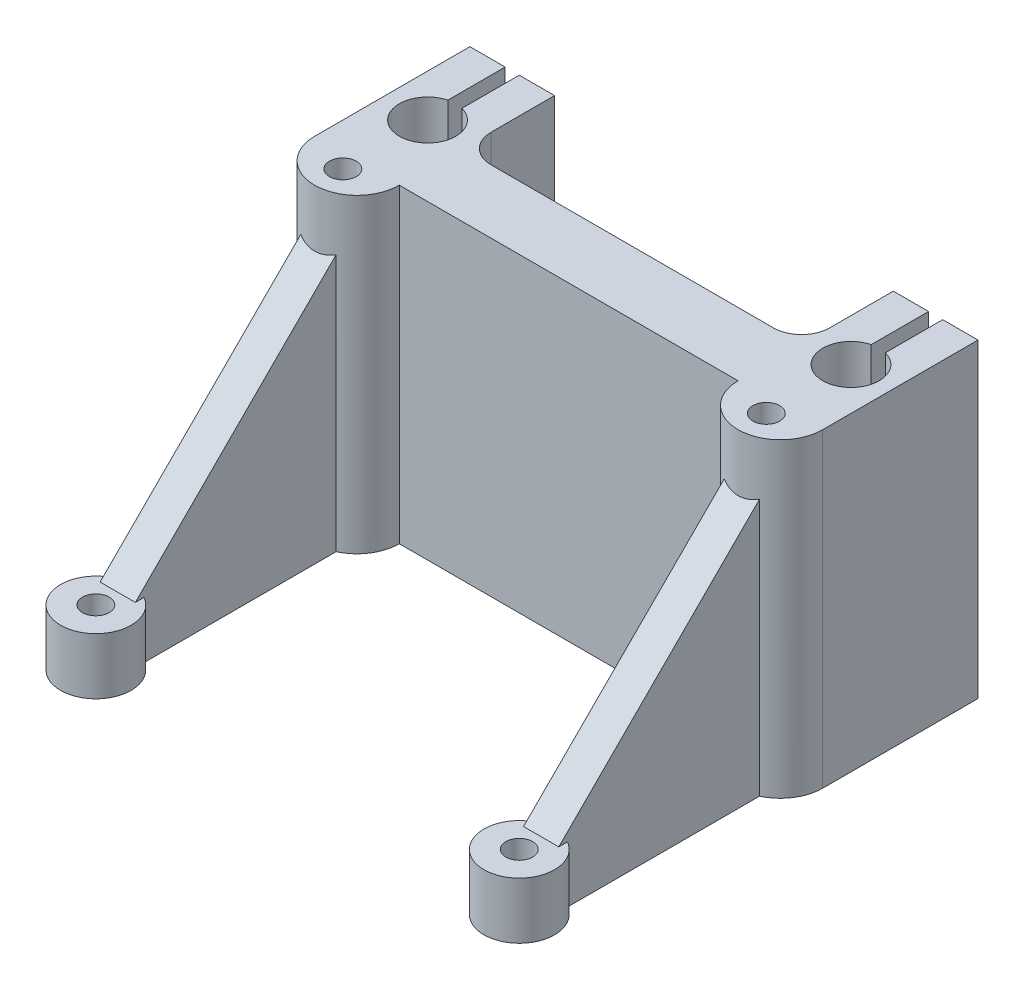
ISO-10303-21;
HEADER;
FILE_DESCRIPTION(('STEP AP214'),'2;1');
FILE_NAME('part.step','',(''),(''),'','','');
FILE_SCHEMA(('AUTOMOTIVE_DESIGN { 1 0 10303 214 1 1 1 1 }'));
ENDSEC;
DATA;
#1=APPLICATION_CONTEXT('core data for automotive mechanical design processes');
#2=APPLICATION_PROTOCOL_DEFINITION('international standard','automotive_design',2000,#1);
#3=PRODUCT_CONTEXT('',#1,'mechanical');
#4=PRODUCT('Part','Part','',(#3));
#5=PRODUCT_RELATED_PRODUCT_CATEGORY('part','',(#4));
#6=PRODUCT_DEFINITION_FORMATION('','',#4);
#7=PRODUCT_DEFINITION_CONTEXT('part definition',#1,'design');
#8=PRODUCT_DEFINITION('design','',#6,#7);
#9=PRODUCT_DEFINITION_SHAPE('','',#8);
#10=(LENGTH_UNIT() NAMED_UNIT(*) SI_UNIT(.MILLI.,.METRE.));
#11=(NAMED_UNIT(*) PLANE_ANGLE_UNIT() SI_UNIT($,.RADIAN.));
#12=(NAMED_UNIT(*) SI_UNIT($,.STERADIAN.) SOLID_ANGLE_UNIT());
#13=UNCERTAINTY_MEASURE_WITH_UNIT(LENGTH_MEASURE(1.E-05),#10,'distance_accuracy_value','');
#14=(GEOMETRIC_REPRESENTATION_CONTEXT(3) GLOBAL_UNCERTAINTY_ASSIGNED_CONTEXT((#13)) GLOBAL_UNIT_ASSIGNED_CONTEXT((#10,
#11,#12)) REPRESENTATION_CONTEXT('',''));
#15=CARTESIAN_POINT('',(0.,0.,0.));
#16=DIRECTION('',(0.,0.,1.));
#17=DIRECTION('',(1.,0.,0.));
#18=AXIS2_PLACEMENT_3D('',#15,#16,#17);
#19=CARTESIAN_POINT('',(30.,8.,47.));
#20=DIRECTION('',(0.,-1.,0.));
#21=DIRECTION('',(0.,0.,-1.));
#22=AXIS2_PLACEMENT_3D('',#19,#20,#21);
#23=CYLINDRICAL_SURFACE('',#22,5.);
#24=CARTESIAN_POINT('',(30.,8.,47.));
#25=DIRECTION('',(0.,1.,0.));
#26=DIRECTION('',(0.,0.,-1.));
#27=AXIS2_PLACEMENT_3D('',#24,#25,#26);
#28=CIRCLE('',#27,5.);
#29=CARTESIAN_POINT('',(30.,8.,42.));
#30=VERTEX_POINT('',#29);
#31=EDGE_CURVE('E11',#30,#30,#28,.T.);
#32=ORIENTED_EDGE('',*,*,#31,.F.);
#33=EDGE_LOOP('',(#32));
#34=FACE_BOUND('',#33,.T.);
#35=CARTESIAN_POINT('',(30.,0.,47.));
#36=DIRECTION('',(0.,1.,0.));
#37=DIRECTION('',(0.,0.,-1.));
#38=AXIS2_PLACEMENT_3D('',#35,#36,#37);
#39=CIRCLE('',#38,5.);
#40=CARTESIAN_POINT('',(30.,0.,42.));
#41=VERTEX_POINT('',#40);
#42=EDGE_CURVE('E43',#41,#41,#39,.T.);
#43=ORIENTED_EDGE('',*,*,#42,.T.);
#44=EDGE_LOOP('',(#43));
#45=FACE_BOUND('',#44,.T.);
#46=ADVANCED_FACE('F40',(#34,#45),#23,.T.);
#47=CARTESIAN_POINT('',(30.,8.,47.));
#48=DIRECTION('',(0.,-1.,0.));
#49=DIRECTION('',(0.,0.,-1.));
#50=AXIS2_PLACEMENT_3D('',#47,#48,#49);
#51=PLANE('',#50);
#52=CARTESIAN_POINT('',(30.0000000000003,8.,46.9999999999998));
#53=DIRECTION('',(0.,1.,0.));
#54=DIRECTION('',(0.,0.,-1.));
#55=AXIS2_PLACEMENT_3D('',#52,#53,#54);
#56=CIRCLE('',#55,1.9);
#57=CARTESIAN_POINT('',(30.0000000000003,8.,45.0999999999998));
#58=VERTEX_POINT('',#57);
#59=EDGE_CURVE('E52',#58,#58,#56,.T.);
#60=ORIENTED_EDGE('',*,*,#59,.F.);
#61=EDGE_LOOP('',(#60));
#62=FACE_BOUND('',#61,.T.);
#63=ORIENTED_EDGE('',*,*,#31,.T.);
#64=EDGE_LOOP('',(#63));
#65=FACE_BOUND('',#64,.T.);
#66=ADVANCED_FACE('F67',(#62,#65),#51,.F.);
#67=CARTESIAN_POINT('',(30.,0.,47.));
#68=DIRECTION('',(0.,-1.,0.));
#69=DIRECTION('',(0.,0.,-1.));
#70=AXIS2_PLACEMENT_3D('',#67,#68,#69);
#71=PLANE('',#70);
#72=CARTESIAN_POINT('',(30.0000000000003,0.,46.9999999999998));
#73=DIRECTION('',(0.,1.,0.));
#74=DIRECTION('',(0.,0.,-1.));
#75=AXIS2_PLACEMENT_3D('',#72,#73,#74);
#76=CIRCLE('',#75,1.9);
#77=CARTESIAN_POINT('',(30.0000000000003,0.,45.0999999999998));
#78=VERTEX_POINT('',#77);
#79=EDGE_CURVE('E50',#78,#78,#76,.T.);
#80=ORIENTED_EDGE('',*,*,#79,.T.);
#81=EDGE_LOOP('',(#80));
#82=FACE_BOUND('',#81,.T.);
#83=ORIENTED_EDGE('',*,*,#42,.F.);
#84=EDGE_LOOP('',(#83));
#85=FACE_BOUND('',#84,.T.);
#86=ADVANCED_FACE('F58',(#82,#85),#71,.T.);
#87=CARTESIAN_POINT('',(30.0000000000003,0.,46.9999999999998));
#88=DIRECTION('',(0.,1.,0.));
#89=DIRECTION('',(0.,0.,1.));
#90=AXIS2_PLACEMENT_3D('',#87,#88,#89);
#91=CYLINDRICAL_SURFACE('',#90,1.9);
#92=ORIENTED_EDGE('',*,*,#79,.F.);
#93=EDGE_LOOP('',(#92));
#94=FACE_BOUND('',#93,.T.);
#95=ORIENTED_EDGE('',*,*,#59,.T.);
#96=EDGE_LOOP('',(#95));
#97=FACE_BOUND('',#96,.T.);
#98=ADVANCED_FACE('F61',(#94,#97),#91,.F.);
#99=CLOSED_SHELL('',(#46,#66,#86,#98));
#100=MANIFOLD_SOLID_BREP('B2',#99);
#101=CARTESIAN_POINT('',(-30.,8.,47.));
#102=DIRECTION('',(0.,-1.,0.));
#103=DIRECTION('',(0.,0.,-1.));
#104=AXIS2_PLACEMENT_3D('',#101,#102,#103);
#105=CYLINDRICAL_SURFACE('',#104,5.);
#106=CARTESIAN_POINT('',(-30.,8.,47.));
#107=DIRECTION('',(0.,1.,0.));
#108=DIRECTION('',(0.,0.,1.));
#109=AXIS2_PLACEMENT_3D('',#106,#107,#108);
#110=CIRCLE('',#109,5.);
#111=CARTESIAN_POINT('',(-30.,8.,52.));
#112=VERTEX_POINT('',#111);
#113=EDGE_CURVE('E39',#112,#112,#110,.T.);
#114=ORIENTED_EDGE('',*,*,#113,.F.);
#115=EDGE_LOOP('',(#114));
#116=FACE_BOUND('',#115,.T.);
#117=CARTESIAN_POINT('',(-30.,0.,47.));
#118=DIRECTION('',(0.,1.,0.));
#119=DIRECTION('',(0.,0.,1.));
#120=AXIS2_PLACEMENT_3D('',#117,#118,#119);
#121=CIRCLE('',#120,5.);
#122=CARTESIAN_POINT('',(-30.,0.,52.));
#123=VERTEX_POINT('',#122);
#124=EDGE_CURVE('E114',#123,#123,#121,.T.);
#125=ORIENTED_EDGE('',*,*,#124,.T.);
#126=EDGE_LOOP('',(#125));
#127=FACE_BOUND('',#126,.T.);
#128=ADVANCED_FACE('F111',(#116,#127),#105,.T.);
#129=CARTESIAN_POINT('',(-30.,8.,47.));
#130=DIRECTION('',(0.,1.,0.));
#131=DIRECTION('',(0.,0.,1.));
#132=AXIS2_PLACEMENT_3D('',#129,#130,#131);
#133=PLANE('',#132);
#134=CARTESIAN_POINT('',(-30.,8.,47.));
#135=DIRECTION('',(0.,1.,0.));
#136=DIRECTION('',(0.,0.,1.));
#137=AXIS2_PLACEMENT_3D('',#134,#135,#136);
#138=CIRCLE('',#137,1.9);
#139=CARTESIAN_POINT('',(-30.,8.,48.9));
#140=VERTEX_POINT('',#139);
#141=EDGE_CURVE('E123',#140,#140,#138,.T.);
#142=ORIENTED_EDGE('',*,*,#141,.F.);
#143=EDGE_LOOP('',(#142));
#144=FACE_BOUND('',#143,.T.);
#145=ORIENTED_EDGE('',*,*,#113,.T.);
#146=EDGE_LOOP('',(#145));
#147=FACE_BOUND('',#146,.T.);
#148=ADVANCED_FACE('F138',(#144,#147),#133,.T.);
#149=CARTESIAN_POINT('',(-30.,0.,47.));
#150=DIRECTION('',(0.,1.,0.));
#151=DIRECTION('',(0.,0.,1.));
#152=AXIS2_PLACEMENT_3D('',#149,#150,#151);
#153=PLANE('',#152);
#154=CARTESIAN_POINT('',(-30.,0.,47.));
#155=DIRECTION('',(0.,1.,0.));
#156=DIRECTION('',(0.,0.,1.));
#157=AXIS2_PLACEMENT_3D('',#154,#155,#156);
#158=CIRCLE('',#157,1.9);
#159=CARTESIAN_POINT('',(-30.,0.,48.9));
#160=VERTEX_POINT('',#159);
#161=EDGE_CURVE('E121',#160,#160,#158,.T.);
#162=ORIENTED_EDGE('',*,*,#161,.T.);
#163=EDGE_LOOP('',(#162));
#164=FACE_BOUND('',#163,.T.);
#165=ORIENTED_EDGE('',*,*,#124,.F.);
#166=EDGE_LOOP('',(#165));
#167=FACE_BOUND('',#166,.T.);
#168=ADVANCED_FACE('F129',(#164,#167),#153,.F.);
#169=CARTESIAN_POINT('',(-30.,0.,47.));
#170=DIRECTION('',(0.,1.,0.));
#171=DIRECTION('',(0.,0.,1.));
#172=AXIS2_PLACEMENT_3D('',#169,#170,#171);
#173=CYLINDRICAL_SURFACE('',#172,1.9);
#174=ORIENTED_EDGE('',*,*,#161,.F.);
#175=EDGE_LOOP('',(#174));
#176=FACE_BOUND('',#175,.T.);
#177=ORIENTED_EDGE('',*,*,#141,.T.);
#178=EDGE_LOOP('',(#177));
#179=FACE_BOUND('',#178,.T.);
#180=ADVANCED_FACE('F132',(#176,#179),#173,.F.);
#181=CLOSED_SHELL('',(#128,#148,#168,#180));
#182=MANIFOLD_SOLID_BREP('B6',#181);
#183=CARTESIAN_POINT('',(30.,44.,10.));
#184=DIRECTION('',(0.,-1.,0.));
#185=DIRECTION('',(0.,0.,-1.));
#186=AXIS2_PLACEMENT_3D('',#183,#184,#185);
#187=CYLINDRICAL_SURFACE('',#186,5.99999999999999);
#188=DIRECTION('',(0.,-1.,0.));
#189=VECTOR('',#188,1.);
#190=CARTESIAN_POINT('',(32.5,44.,15.4543560573179));
#191=LINE('',#190,#189);
#192=CARTESIAN_POINT('',(32.5,0.,15.4543560573179));
#193=VERTEX_POINT('',#192);
#194=CARTESIAN_POINT('',(32.5,36.4456439426818,15.4543560573179));
#195=VERTEX_POINT('',#194);
#196=EDGE_CURVE('E109',#193,#195,#191,.F.);
#197=ORIENTED_EDGE('',*,*,#196,.F.);
#198=CARTESIAN_POINT('',(30.,0.,10.));
#199=DIRECTION('',(0.,1.,0.));
#200=DIRECTION('',(0.,0.,1.));
#201=AXIS2_PLACEMENT_3D('',#198,#199,#200);
#202=CIRCLE('',#201,5.99999999999999);
#203=CARTESIAN_POINT('',(36.,0.,10.));
#204=VERTEX_POINT('',#203);
#205=EDGE_CURVE('E366',#193,#204,#202,.T.);
#206=ORIENTED_EDGE('',*,*,#205,.T.);
#207=DIRECTION('',(0.,-1.,0.));
#208=VECTOR('',#207,1.);
#209=CARTESIAN_POINT('',(36.,44.,10.));
#210=LINE('',#209,#208);
#211=CARTESIAN_POINT('',(36.,44.,10.));
#212=VERTEX_POINT('',#211);
#213=EDGE_CURVE('E511',#212,#204,#210,.T.);
#214=ORIENTED_EDGE('',*,*,#213,.F.);
#215=CARTESIAN_POINT('',(30.,44.,10.));
#216=DIRECTION('',(0.,1.,0.));
#217=DIRECTION('',(0.,0.,1.));
#218=AXIS2_PLACEMENT_3D('',#215,#216,#217);
#219=CIRCLE('',#218,5.99999999999999);
#220=CARTESIAN_POINT('',(24.,44.,10.));
#221=VERTEX_POINT('',#220);
#222=EDGE_CURVE('E509',#221,#212,#219,.T.);
#223=ORIENTED_EDGE('',*,*,#222,.F.);
#224=DIRECTION('',(0.,-1.,0.));
#225=VECTOR('',#224,1.);
#226=CARTESIAN_POINT('',(24.,44.,10.));
#227=LINE('',#226,#225);
#228=CARTESIAN_POINT('',(24.,0.,10.));
#229=VERTEX_POINT('',#228);
#230=EDGE_CURVE('E532',#221,#229,#227,.T.);
#231=ORIENTED_EDGE('',*,*,#230,.T.);
#232=CARTESIAN_POINT('',(27.5,0.,15.4543560573179));
#233=VERTEX_POINT('',#232);
#234=EDGE_CURVE('E497',#229,#233,#202,.T.);
#235=ORIENTED_EDGE('',*,*,#234,.T.);
#236=DIRECTION('',(0.,-1.,0.));
#237=VECTOR('',#236,1.);
#238=CARTESIAN_POINT('',(27.5,44.,15.4543560573178));
#239=LINE('',#238,#237);
#240=CARTESIAN_POINT('',(27.5,36.4456439426818,15.4543560573178));
#241=VERTEX_POINT('',#240);
#242=EDGE_CURVE('E181',#233,#241,#239,.F.);
#243=ORIENTED_EDGE('',*,*,#242,.T.);
#244=CARTESIAN_POINT('',(30.,41.8999999999996,10.));
#245=DIRECTION('',(0.,0.707106781186552,0.707106781186543));
#246=DIRECTION('',(0.,-0.707106781186543,0.707106781186552));
#247=AXIS2_PLACEMENT_3D('',#244,#245,#246);
#248=ELLIPSE('',#247,8.48528137423851,5.99999999999999);
#249=EDGE_CURVE('E378',#241,#195,#248,.T.);
#250=ORIENTED_EDGE('',*,*,#249,.T.);
#251=EDGE_LOOP('',(#197,#206,#214,#223,#231,#235,#243,#250));
#252=FACE_BOUND('',#251,.T.);
#253=ADVANCED_FACE('F173',(#252),#187,.T.);
#254=CARTESIAN_POINT('',(-30.,44.,10.));
#255=DIRECTION('',(0.,-1.,0.));
#256=DIRECTION('',(0.,0.,-1.));
#257=AXIS2_PLACEMENT_3D('',#254,#255,#256);
#258=CYLINDRICAL_SURFACE('',#257,6.);
#259=DIRECTION('',(0.,-1.,0.));
#260=VECTOR('',#259,1.);
#261=CARTESIAN_POINT('',(-32.5,44.,15.4543560573179));
#262=LINE('',#261,#260);
#263=CARTESIAN_POINT('',(-32.5,36.4456439426818,15.4543560573179));
#264=VERTEX_POINT('',#263);
#265=CARTESIAN_POINT('',(-32.5,0.,15.4543560573179));
#266=VERTEX_POINT('',#265);
#267=EDGE_CURVE('E579',#264,#266,#262,.T.);
#268=ORIENTED_EDGE('',*,*,#267,.F.);
#269=CARTESIAN_POINT('',(-30.,41.8999999999996,10.));
#270=DIRECTION('',(0.,-0.707106781186552,-0.707106781186543));
#271=DIRECTION('',(0.,-0.707106781186543,0.707106781186552));
#272=AXIS2_PLACEMENT_3D('',#269,#270,#271);
#273=ELLIPSE('',#272,8.48528137423852,6.);
#274=CARTESIAN_POINT('',(-27.5,36.4456439426818,15.4543560573179));
#275=VERTEX_POINT('',#274);
#276=EDGE_CURVE('E414',#275,#264,#273,.T.);
#277=ORIENTED_EDGE('',*,*,#276,.F.);
#278=DIRECTION('',(0.,-1.,0.));
#279=VECTOR('',#278,1.);
#280=CARTESIAN_POINT('',(-27.5,44.,15.4543560573179));
#281=LINE('',#280,#279);
#282=CARTESIAN_POINT('',(-27.5,0.,15.4543560573179));
#283=VERTEX_POINT('',#282);
#284=EDGE_CURVE('E577',#275,#283,#281,.T.);
#285=ORIENTED_EDGE('',*,*,#284,.T.);
#286=CARTESIAN_POINT('',(-30.,0.,10.));
#287=DIRECTION('',(0.,1.,0.));
#288=DIRECTION('',(0.,0.,-1.));
#289=AXIS2_PLACEMENT_3D('',#286,#287,#288);
#290=CIRCLE('',#289,6.);
#291=CARTESIAN_POINT('',(-24.,0.,10.));
#292=VERTEX_POINT('',#291);
#293=EDGE_CURVE('E522',#283,#292,#290,.T.);
#294=ORIENTED_EDGE('',*,*,#293,.T.);
#295=DIRECTION('',(0.,-1.,0.));
#296=VECTOR('',#295,1.);
#297=CARTESIAN_POINT('',(-24.,44.,10.));
#298=LINE('',#297,#296);
#299=CARTESIAN_POINT('',(-24.,44.,10.));
#300=VERTEX_POINT('',#299);
#301=EDGE_CURVE('E535',#300,#292,#298,.T.);
#302=ORIENTED_EDGE('',*,*,#301,.F.);
#303=CARTESIAN_POINT('',(-30.,44.,10.));
#304=DIRECTION('',(0.,1.,0.));
#305=DIRECTION('',(0.,0.,-1.));
#306=AXIS2_PLACEMENT_3D('',#303,#304,#305);
#307=CIRCLE('',#306,6.);
#308=CARTESIAN_POINT('',(-36.,44.,10.));
#309=VERTEX_POINT('',#308);
#310=EDGE_CURVE('E505',#309,#300,#307,.T.);
#311=ORIENTED_EDGE('',*,*,#310,.F.);
#312=DIRECTION('',(0.,-1.,0.));
#313=VECTOR('',#312,1.);
#314=CARTESIAN_POINT('',(-36.,44.,10.));
#315=LINE('',#314,#313);
#316=CARTESIAN_POINT('',(-36.,0.,10.));
#317=VERTEX_POINT('',#316);
#318=EDGE_CURVE('E538',#309,#317,#315,.T.);
#319=ORIENTED_EDGE('',*,*,#318,.T.);
#320=EDGE_CURVE('E523',#317,#266,#290,.T.);
#321=ORIENTED_EDGE('',*,*,#320,.T.);
#322=EDGE_LOOP('',(#268,#277,#285,#294,#302,#311,#319,#321));
#323=FACE_BOUND('',#322,.T.);
#324=ADVANCED_FACE('F603',(#323),#258,.T.);
#325=CARTESIAN_POINT('',(-36.,44.,-12.));
#326=DIRECTION('',(0.,0.,1.));
#327=DIRECTION('',(1.,0.,0.));
#328=AXIS2_PLACEMENT_3D('',#325,#326,#327);
#329=PLANE('',#328);
#330=DIRECTION('',(-1.,0.,0.));
#331=VECTOR('',#330,1.);
#332=CARTESIAN_POINT('',(-36.,0.,-12.));
#333=LINE('',#332,#331);
#334=CARTESIAN_POINT('',(29.,0.,-12.));
#335=VERTEX_POINT('',#334);
#336=CARTESIAN_POINT('',(24.,0.,-12.));
#337=VERTEX_POINT('',#336);
#338=EDGE_CURVE('E519',#335,#337,#333,.T.);
#339=ORIENTED_EDGE('',*,*,#338,.T.);
#340=DIRECTION('',(0.,1.,0.));
#341=VECTOR('',#340,1.);
#342=CARTESIAN_POINT('',(24.,0.,-12.));
#343=LINE('',#342,#341);
#344=CARTESIAN_POINT('',(24.,44.,-12.));
#345=VERTEX_POINT('',#344);
#346=EDGE_CURVE('E426',#337,#345,#343,.T.);
#347=ORIENTED_EDGE('',*,*,#346,.T.);
#348=DIRECTION('',(-1.,0.,0.));
#349=VECTOR('',#348,1.);
#350=CARTESIAN_POINT('',(-36.,44.,-12.));
#351=LINE('',#350,#349);
#352=CARTESIAN_POINT('',(29.,44.,-12.));
#353=VERTEX_POINT('',#352);
#354=EDGE_CURVE('E502',#353,#345,#351,.T.);
#355=ORIENTED_EDGE('',*,*,#354,.F.);
#356=DIRECTION('',(0.,1.,0.));
#357=VECTOR('',#356,1.);
#358=CARTESIAN_POINT('',(29.,0.,-12.));
#359=LINE('',#358,#357);
#360=EDGE_CURVE('E448',#335,#353,#359,.T.);
#361=ORIENTED_EDGE('',*,*,#360,.F.);
#362=EDGE_LOOP('',(#339,#347,#355,#361));
#363=FACE_BOUND('',#362,.T.);
#364=ADVANCED_FACE('F628',(#363),#329,.F.);
#365=CARTESIAN_POINT('',(-30.,44.,10.));
#366=DIRECTION('',(0.,-1.,0.));
#367=DIRECTION('',(0.,0.,-1.));
#368=AXIS2_PLACEMENT_3D('',#365,#366,#367);
#369=PLANE('',#368);
#370=CARTESIAN_POINT('',(30.,44.,12.));
#371=DIRECTION('',(0.,-1.,0.));
#372=DIRECTION('',(0.,0.,1.));
#373=AXIS2_PLACEMENT_3D('',#370,#371,#372);
#374=CIRCLE('',#373,1.9);
#375=CARTESIAN_POINT('',(30.,44.,13.9));
#376=VERTEX_POINT('',#375);
#377=EDGE_CURVE('E450',#376,#376,#374,.T.);
#378=ORIENTED_EDGE('',*,*,#377,.T.);
#379=EDGE_LOOP('',(#378));
#380=FACE_BOUND('',#379,.T.);
#381=CARTESIAN_POINT('',(-30.,44.,12.));
#382=DIRECTION('',(0.,1.,0.));
#383=DIRECTION('',(0.,0.,1.));
#384=AXIS2_PLACEMENT_3D('',#381,#382,#383);
#385=CIRCLE('',#384,1.9);
#386=CARTESIAN_POINT('',(-30.,44.,13.9));
#387=VERTEX_POINT('',#386);
#388=EDGE_CURVE('E478',#387,#387,#385,.T.);
#389=ORIENTED_EDGE('',*,*,#388,.F.);
#390=EDGE_LOOP('',(#389));
#391=FACE_BOUND('',#390,.T.);
#392=ORIENTED_EDGE('',*,*,#354,.T.);
#393=DIRECTION('',(0.,0.,-1.));
#394=VECTOR('',#393,1.);
#395=CARTESIAN_POINT('',(24.,44.,1.));
#396=LINE('',#395,#394);
#397=CARTESIAN_POINT('',(24.,44.,-3.));
#398=VERTEX_POINT('',#397);
#399=EDGE_CURVE('E416',#398,#345,#396,.T.);
#400=ORIENTED_EDGE('',*,*,#399,.F.);
#401=CARTESIAN_POINT('',(20.,44.,-3.));
#402=DIRECTION('',(0.,-1.,0.));
#403=DIRECTION('',(0.,0.,-1.));
#404=AXIS2_PLACEMENT_3D('',#401,#402,#403);
#405=CIRCLE('',#404,4.);
#406=CARTESIAN_POINT('',(20.,44.,1.));
#407=VERTEX_POINT('',#406);
#408=EDGE_CURVE('E569',#398,#407,#405,.T.);
#409=ORIENTED_EDGE('',*,*,#408,.T.);
#410=DIRECTION('',(1.,0.,0.));
#411=VECTOR('',#410,1.);
#412=CARTESIAN_POINT('',(-24.,44.,1.));
#413=LINE('',#412,#411);
#414=CARTESIAN_POINT('',(-20.,44.,1.));
#415=VERTEX_POINT('',#414);
#416=EDGE_CURVE('E420',#415,#407,#413,.T.);
#417=ORIENTED_EDGE('',*,*,#416,.F.);
#418=CARTESIAN_POINT('',(-20.,44.,-3.));
#419=DIRECTION('',(0.,-1.,0.));
#420=DIRECTION('',(0.,0.,-1.));
#421=AXIS2_PLACEMENT_3D('',#418,#419,#420);
#422=CIRCLE('',#421,4.);
#423=CARTESIAN_POINT('',(-24.,44.,-3.));
#424=VERTEX_POINT('',#423);
#425=EDGE_CURVE('E573',#415,#424,#422,.T.);
#426=ORIENTED_EDGE('',*,*,#425,.T.);
#427=DIRECTION('',(0.,0.,1.));
#428=VECTOR('',#427,1.);
#429=CARTESIAN_POINT('',(-24.,44.,1.));
#430=LINE('',#429,#428);
#431=CARTESIAN_POINT('',(-24.,44.,-12.));
#432=VERTEX_POINT('',#431);
#433=EDGE_CURVE('E428',#432,#424,#430,.T.);
#434=ORIENTED_EDGE('',*,*,#433,.F.);
#435=CARTESIAN_POINT('',(-29.,44.,-12.));
#436=VERTEX_POINT('',#435);
#437=EDGE_CURVE('E503',#432,#436,#351,.T.);
#438=ORIENTED_EDGE('',*,*,#437,.T.);
#439=DIRECTION('',(0.,0.,-1.));
#440=VECTOR('',#439,1.);
#441=CARTESIAN_POINT('',(-29.,44.,-12.));
#442=LINE('',#441,#440);
#443=CARTESIAN_POINT('',(-29.,44.,-3.87298334620742));
#444=VERTEX_POINT('',#443);
#445=EDGE_CURVE('E462',#444,#436,#442,.T.);
#446=ORIENTED_EDGE('',*,*,#445,.F.);
#447=CARTESIAN_POINT('',(-30.,44.,0.));
#448=DIRECTION('',(0.,1.,0.));
#449=DIRECTION('',(0.,0.,1.));
#450=AXIS2_PLACEMENT_3D('',#447,#448,#449);
#451=CIRCLE('',#450,4.);
#452=CARTESIAN_POINT('',(-31.,44.,-3.87298334620741));
#453=VERTEX_POINT('',#452);
#454=EDGE_CURVE('E484',#453,#444,#451,.T.);
#455=ORIENTED_EDGE('',*,*,#454,.F.);
#456=DIRECTION('',(0.,0.,1.));
#457=VECTOR('',#456,1.);
#458=CARTESIAN_POINT('',(-31.,44.,-12.));
#459=LINE('',#458,#457);
#460=CARTESIAN_POINT('',(-31.,44.,-12.));
#461=VERTEX_POINT('',#460);
#462=EDGE_CURVE('E469',#461,#453,#459,.T.);
#463=ORIENTED_EDGE('',*,*,#462,.F.);
#464=CARTESIAN_POINT('',(-36.,44.,-12.));
#465=VERTEX_POINT('',#464);
#466=EDGE_CURVE('E496',#461,#465,#351,.T.);
#467=ORIENTED_EDGE('',*,*,#466,.T.);
#468=DIRECTION('',(0.,0.,1.));
#469=VECTOR('',#468,1.);
#470=CARTESIAN_POINT('',(-36.,44.,10.));
#471=LINE('',#470,#469);
#472=EDGE_CURVE('E501',#465,#309,#471,.T.);
#473=ORIENTED_EDGE('',*,*,#472,.T.);
#474=ORIENTED_EDGE('',*,*,#310,.T.);
#475=DIRECTION('',(1.,0.,0.));
#476=VECTOR('',#475,1.);
#477=CARTESIAN_POINT('',(-24.,44.,10.));
#478=LINE('',#477,#476);
#479=EDGE_CURVE('E507',#300,#221,#478,.T.);
#480=ORIENTED_EDGE('',*,*,#479,.T.);
#481=ORIENTED_EDGE('',*,*,#222,.T.);
#482=DIRECTION('',(0.,0.,-1.));
#483=VECTOR('',#482,1.);
#484=CARTESIAN_POINT('',(36.,44.,10.));
#485=LINE('',#484,#483);
#486=CARTESIAN_POINT('',(36.,44.,-12.));
#487=VERTEX_POINT('',#486);
#488=EDGE_CURVE('E493',#212,#487,#485,.T.);
#489=ORIENTED_EDGE('',*,*,#488,.T.);
#490=CARTESIAN_POINT('',(31.,44.,-12.));
#491=VERTEX_POINT('',#490);
#492=EDGE_CURVE('E498',#487,#491,#351,.T.);
#493=ORIENTED_EDGE('',*,*,#492,.T.);
#494=DIRECTION('',(0.,0.,1.));
#495=VECTOR('',#494,1.);
#496=CARTESIAN_POINT('',(31.,44.,-12.));
#497=LINE('',#496,#495);
#498=CARTESIAN_POINT('',(31.,44.,-3.87298334620741));
#499=VERTEX_POINT('',#498);
#500=EDGE_CURVE('E441',#491,#499,#497,.T.);
#501=ORIENTED_EDGE('',*,*,#500,.T.);
#502=CARTESIAN_POINT('',(30.,44.,0.));
#503=DIRECTION('',(0.,-1.,0.));
#504=DIRECTION('',(0.,0.,1.));
#505=AXIS2_PLACEMENT_3D('',#502,#503,#504);
#506=CIRCLE('',#505,4.);
#507=CARTESIAN_POINT('',(29.,44.,-3.87298334620742));
#508=VERTEX_POINT('',#507);
#509=EDGE_CURVE('E456',#499,#508,#506,.T.);
#510=ORIENTED_EDGE('',*,*,#509,.T.);
#511=DIRECTION('',(0.,0.,-1.));
#512=VECTOR('',#511,1.);
#513=CARTESIAN_POINT('',(29.,44.,-12.));
#514=LINE('',#513,#512);
#515=EDGE_CURVE('E435',#508,#353,#514,.T.);
#516=ORIENTED_EDGE('',*,*,#515,.T.);
#517=EDGE_LOOP('',(#392,#400,#409,#417,#426,#434,#438,#446,#455,#463,#467,#473,#474,#480,#481,
#489,#493,#501,#510,#516));
#518=FACE_BOUND('',#517,.T.);
#519=ADVANCED_FACE('F596',(#380,#391,#518),#369,.F.);
#520=CARTESIAN_POINT('',(-30.,0.,10.));
#521=DIRECTION('',(0.,-1.,0.));
#522=DIRECTION('',(0.,0.,-1.));
#523=AXIS2_PLACEMENT_3D('',#520,#521,#522);
#524=PLANE('',#523);
#525=CARTESIAN_POINT('',(30.,0.,12.));
#526=DIRECTION('',(0.,-1.,0.));
#527=DIRECTION('',(0.,0.,1.));
#528=AXIS2_PLACEMENT_3D('',#525,#526,#527);
#529=CIRCLE('',#528,1.9);
#530=CARTESIAN_POINT('',(30.,0.,13.9));
#531=VERTEX_POINT('',#530);
#532=EDGE_CURVE('E453',#531,#531,#529,.T.);
#533=ORIENTED_EDGE('',*,*,#532,.F.);
#534=EDGE_LOOP('',(#533));
#535=FACE_BOUND('',#534,.T.);
#536=ORIENTED_EDGE('',*,*,#205,.F.);
#537=DIRECTION('',(0.,0.,1.));
#538=VECTOR('',#537,1.);
#539=CARTESIAN_POINT('',(32.5,0.,43.9));
#540=LINE('',#539,#538);
#541=CARTESIAN_POINT('',(32.5,0.,43.9));
#542=VERTEX_POINT('',#541);
#543=EDGE_CURVE('E358',#193,#542,#540,.T.);
#544=ORIENTED_EDGE('',*,*,#543,.T.);
#545=DIRECTION('',(-1.,0.,0.));
#546=VECTOR('',#545,1.);
#547=CARTESIAN_POINT('',(32.5,0.,43.9));
#548=LINE('',#547,#546);
#549=CARTESIAN_POINT('',(27.5,0.,43.9));
#550=VERTEX_POINT('',#549);
#551=EDGE_CURVE('E363',#542,#550,#548,.T.);
#552=ORIENTED_EDGE('',*,*,#551,.T.);
#553=DIRECTION('',(0.,0.,1.));
#554=VECTOR('',#553,1.);
#555=CARTESIAN_POINT('',(27.5,0.,43.9));
#556=LINE('',#555,#554);
#557=EDGE_CURVE('E384',#233,#550,#556,.T.);
#558=ORIENTED_EDGE('',*,*,#557,.F.);
#559=ORIENTED_EDGE('',*,*,#234,.F.);
#560=DIRECTION('',(1.,0.,0.));
#561=VECTOR('',#560,1.);
#562=CARTESIAN_POINT('',(-24.,0.,10.));
#563=LINE('',#562,#561);
#564=EDGE_CURVE('E526',#292,#229,#563,.T.);
#565=ORIENTED_EDGE('',*,*,#564,.F.);
#566=ORIENTED_EDGE('',*,*,#293,.F.);
#567=DIRECTION('',(0.,0.,1.));
#568=VECTOR('',#567,1.);
#569=CARTESIAN_POINT('',(-27.5,0.,43.9));
#570=LINE('',#569,#568);
#571=CARTESIAN_POINT('',(-27.5,0.,43.9));
#572=VERTEX_POINT('',#571);
#573=EDGE_CURVE('E196',#283,#572,#570,.T.);
#574=ORIENTED_EDGE('',*,*,#573,.T.);
#575=DIRECTION('',(1.,0.,0.));
#576=VECTOR('',#575,1.);
#577=CARTESIAN_POINT('',(-32.5,0.,43.9));
#578=LINE('',#577,#576);
#579=CARTESIAN_POINT('',(-32.5,0.,43.9));
#580=VERTEX_POINT('',#579);
#581=EDGE_CURVE('E402',#580,#572,#578,.T.);
#582=ORIENTED_EDGE('',*,*,#581,.F.);
#583=DIRECTION('',(0.,0.,1.));
#584=VECTOR('',#583,1.);
#585=CARTESIAN_POINT('',(-32.5,0.,43.9));
#586=LINE('',#585,#584);
#587=EDGE_CURVE('E400',#266,#580,#586,.T.);
#588=ORIENTED_EDGE('',*,*,#587,.F.);
#589=ORIENTED_EDGE('',*,*,#320,.F.);
#590=DIRECTION('',(0.,0.,1.));
#591=VECTOR('',#590,1.);
#592=CARTESIAN_POINT('',(-36.,0.,10.));
#593=LINE('',#592,#591);
#594=CARTESIAN_POINT('',(-36.,0.,-12.));
#595=VERTEX_POINT('',#594);
#596=EDGE_CURVE('E518',#595,#317,#593,.T.);
#597=ORIENTED_EDGE('',*,*,#596,.F.);
#598=CARTESIAN_POINT('',(-31.,0.,-12.));
#599=VERTEX_POINT('',#598);
#600=EDGE_CURVE('E514',#599,#595,#333,.T.);
#601=ORIENTED_EDGE('',*,*,#600,.F.);
#602=DIRECTION('',(0.,0.,1.));
#603=VECTOR('',#602,1.);
#604=CARTESIAN_POINT('',(-31.,0.,-12.));
#605=LINE('',#604,#603);
#606=CARTESIAN_POINT('',(-31.,0.,-3.87298334620741));
#607=VERTEX_POINT('',#606);
#608=EDGE_CURVE('E468',#599,#607,#605,.T.);
#609=ORIENTED_EDGE('',*,*,#608,.T.);
#610=CARTESIAN_POINT('',(-30.,0.,0.));
#611=DIRECTION('',(0.,1.,0.));
#612=DIRECTION('',(0.,0.,1.));
#613=AXIS2_PLACEMENT_3D('',#610,#611,#612);
#614=CIRCLE('',#613,4.);
#615=CARTESIAN_POINT('',(-29.,0.,-3.87298334620742));
#616=VERTEX_POINT('',#615);
#617=EDGE_CURVE('E487',#607,#616,#614,.T.);
#618=ORIENTED_EDGE('',*,*,#617,.T.);
#619=DIRECTION('',(0.,0.,-1.));
#620=VECTOR('',#619,1.);
#621=CARTESIAN_POINT('',(-29.,0.,-12.));
#622=LINE('',#621,#620);
#623=CARTESIAN_POINT('',(-29.,0.,-12.));
#624=VERTEX_POINT('',#623);
#625=EDGE_CURVE('E465',#616,#624,#622,.T.);
#626=ORIENTED_EDGE('',*,*,#625,.T.);
#627=CARTESIAN_POINT('',(-24.,0.,-12.));
#628=VERTEX_POINT('',#627);
#629=EDGE_CURVE('E520',#628,#624,#333,.T.);
#630=ORIENTED_EDGE('',*,*,#629,.F.);
#631=DIRECTION('',(0.,0.,1.));
#632=VECTOR('',#631,1.);
#633=CARTESIAN_POINT('',(-24.,0.,1.));
#634=LINE('',#633,#632);
#635=CARTESIAN_POINT('',(-24.,0.,-3.));
#636=VERTEX_POINT('',#635);
#637=EDGE_CURVE('E419',#628,#636,#634,.T.);
#638=ORIENTED_EDGE('',*,*,#637,.T.);
#639=CARTESIAN_POINT('',(-20.,0.,-3.));
#640=DIRECTION('',(0.,-1.,0.));
#641=DIRECTION('',(0.,0.,-1.));
#642=AXIS2_PLACEMENT_3D('',#639,#640,#641);
#643=CIRCLE('',#642,4.);
#644=CARTESIAN_POINT('',(-20.,0.,1.));
#645=VERTEX_POINT('',#644);
#646=EDGE_CURVE('E575',#636,#645,#643,.F.);
#647=ORIENTED_EDGE('',*,*,#646,.T.);
#648=DIRECTION('',(1.,0.,0.));
#649=VECTOR('',#648,1.);
#650=CARTESIAN_POINT('',(-24.,0.,1.));
#651=LINE('',#650,#649);
#652=CARTESIAN_POINT('',(20.,0.,1.));
#653=VERTEX_POINT('',#652);
#654=EDGE_CURVE('E423',#645,#653,#651,.T.);
#655=ORIENTED_EDGE('',*,*,#654,.T.);
#656=CARTESIAN_POINT('',(20.,0.,-3.));
#657=DIRECTION('',(0.,-1.,0.));
#658=DIRECTION('',(0.,0.,-1.));
#659=AXIS2_PLACEMENT_3D('',#656,#657,#658);
#660=CIRCLE('',#659,4.);
#661=CARTESIAN_POINT('',(24.,0.,-3.));
#662=VERTEX_POINT('',#661);
#663=EDGE_CURVE('E571',#653,#662,#660,.F.);
#664=ORIENTED_EDGE('',*,*,#663,.T.);
#665=DIRECTION('',(0.,0.,-1.));
#666=VECTOR('',#665,1.);
#667=CARTESIAN_POINT('',(24.,0.,1.));
#668=LINE('',#667,#666);
#669=EDGE_CURVE('E417',#662,#337,#668,.T.);
#670=ORIENTED_EDGE('',*,*,#669,.T.);
#671=ORIENTED_EDGE('',*,*,#338,.F.);
#672=DIRECTION('',(0.,0.,-1.));
#673=VECTOR('',#672,1.);
#674=CARTESIAN_POINT('',(29.,0.,-12.));
#675=LINE('',#674,#673);
#676=CARTESIAN_POINT('',(29.,0.,-3.87298334620742));
#677=VERTEX_POINT('',#676);
#678=EDGE_CURVE('E438',#677,#335,#675,.T.);
#679=ORIENTED_EDGE('',*,*,#678,.F.);
#680=CARTESIAN_POINT('',(30.,0.,0.));
#681=DIRECTION('',(0.,-1.,0.));
#682=DIRECTION('',(0.,0.,1.));
#683=AXIS2_PLACEMENT_3D('',#680,#681,#682);
#684=CIRCLE('',#683,4.);
#685=CARTESIAN_POINT('',(31.,0.,-3.87298334620741));
#686=VERTEX_POINT('',#685);
#687=EDGE_CURVE('E459',#686,#677,#684,.T.);
#688=ORIENTED_EDGE('',*,*,#687,.F.);
#689=DIRECTION('',(0.,0.,1.));
#690=VECTOR('',#689,1.);
#691=CARTESIAN_POINT('',(31.,0.,-12.));
#692=LINE('',#691,#690);
#693=CARTESIAN_POINT('',(31.,0.,-12.));
#694=VERTEX_POINT('',#693);
#695=EDGE_CURVE('E440',#694,#686,#692,.T.);
#696=ORIENTED_EDGE('',*,*,#695,.F.);
#697=CARTESIAN_POINT('',(36.,0.,-12.));
#698=VERTEX_POINT('',#697);
#699=EDGE_CURVE('E515',#698,#694,#333,.T.);
#700=ORIENTED_EDGE('',*,*,#699,.F.);
#701=DIRECTION('',(0.,0.,-1.));
#702=VECTOR('',#701,1.);
#703=CARTESIAN_POINT('',(36.,0.,10.));
#704=LINE('',#703,#702);
#705=EDGE_CURVE('E490',#204,#698,#704,.T.);
#706=ORIENTED_EDGE('',*,*,#705,.F.);
#707=EDGE_LOOP('',(#536,#544,#552,#558,#559,#565,#566,#574,#582,#588,#589,#597,#601,#609,#618,
#626,#630,#638,#647,#655,#664,#670,#671,#679,#688,#696,#700,#706));
#708=FACE_BOUND('',#707,.T.);
#709=CARTESIAN_POINT('',(-30.,0.,12.));
#710=DIRECTION('',(0.,1.,0.));
#711=DIRECTION('',(0.,0.,1.));
#712=AXIS2_PLACEMENT_3D('',#709,#710,#711);
#713=CIRCLE('',#712,1.9);
#714=CARTESIAN_POINT('',(-30.,0.,13.9));
#715=VERTEX_POINT('',#714);
#716=EDGE_CURVE('E481',#715,#715,#713,.T.);
#717=ORIENTED_EDGE('',*,*,#716,.T.);
#718=EDGE_LOOP('',(#717));
#719=FACE_BOUND('',#718,.T.);
#720=ADVANCED_FACE('F360',(#535,#708,#719),#524,.T.);
#721=ORIENTED_EDGE('',*,*,#437,.F.);
#722=DIRECTION('',(0.,1.,0.));
#723=VECTOR('',#722,1.);
#724=CARTESIAN_POINT('',(-24.,0.,-12.));
#725=LINE('',#724,#723);
#726=EDGE_CURVE('E433',#628,#432,#725,.T.);
#727=ORIENTED_EDGE('',*,*,#726,.F.);
#728=ORIENTED_EDGE('',*,*,#629,.T.);
#729=DIRECTION('',(0.,1.,0.));
#730=VECTOR('',#729,1.);
#731=CARTESIAN_POINT('',(-29.,0.,-12.));
#732=LINE('',#731,#730);
#733=EDGE_CURVE('E472',#624,#436,#732,.T.);
#734=ORIENTED_EDGE('',*,*,#733,.T.);
#735=EDGE_LOOP('',(#721,#727,#728,#734));
#736=FACE_BOUND('',#735,.T.);
#737=ADVANCED_FACE('F657',(#736),#329,.F.);
#738=DIRECTION('',(0.,1.,0.));
#739=VECTOR('',#738,1.);
#740=CARTESIAN_POINT('',(31.,0.,-12.));
#741=LINE('',#740,#739);
#742=EDGE_CURVE('E443',#694,#491,#741,.T.);
#743=ORIENTED_EDGE('',*,*,#742,.T.);
#744=ORIENTED_EDGE('',*,*,#492,.F.);
#745=DIRECTION('',(0.,-1.,0.));
#746=VECTOR('',#745,1.);
#747=CARTESIAN_POINT('',(36.,44.,-12.));
#748=LINE('',#747,#746);
#749=EDGE_CURVE('E544',#487,#698,#748,.T.);
#750=ORIENTED_EDGE('',*,*,#749,.T.);
#751=ORIENTED_EDGE('',*,*,#699,.T.);
#752=EDGE_LOOP('',(#743,#744,#750,#751));
#753=FACE_BOUND('',#752,.T.);
#754=ADVANCED_FACE('F647',(#753),#329,.F.);
#755=CARTESIAN_POINT('',(30.,0.,0.));
#756=DIRECTION('',(0.,1.,0.));
#757=DIRECTION('',(0.,0.,1.));
#758=AXIS2_PLACEMENT_3D('',#755,#756,#757);
#759=CYLINDRICAL_SURFACE('',#758,4.);
#760=ORIENTED_EDGE('',*,*,#687,.T.);
#761=DIRECTION('',(0.,1.,0.));
#762=VECTOR('',#761,1.);
#763=CARTESIAN_POINT('',(29.,0.,-3.87298334620742));
#764=LINE('',#763,#762);
#765=EDGE_CURVE('E556',#677,#508,#764,.T.);
#766=ORIENTED_EDGE('',*,*,#765,.T.);
#767=ORIENTED_EDGE('',*,*,#509,.F.);
#768=DIRECTION('',(0.,1.,0.));
#769=VECTOR('',#768,1.);
#770=CARTESIAN_POINT('',(31.,0.,-3.87298334620741));
#771=LINE('',#770,#769);
#772=EDGE_CURVE('E553',#499,#686,#771,.F.);
#773=ORIENTED_EDGE('',*,*,#772,.T.);
#774=EDGE_LOOP('',(#760,#766,#767,#773));
#775=FACE_BOUND('',#774,.T.);
#776=ADVANCED_FACE('F653',(#775),#759,.F.);
#777=CARTESIAN_POINT('',(36.,44.,10.));
#778=DIRECTION('',(-1.,0.,0.));
#779=DIRECTION('',(0.,0.,1.));
#780=AXIS2_PLACEMENT_3D('',#777,#778,#779);
#781=PLANE('',#780);
#782=ORIENTED_EDGE('',*,*,#705,.T.);
#783=ORIENTED_EDGE('',*,*,#749,.F.);
#784=ORIENTED_EDGE('',*,*,#488,.F.);
#785=ORIENTED_EDGE('',*,*,#213,.T.);
#786=EDGE_LOOP('',(#782,#783,#784,#785));
#787=FACE_BOUND('',#786,.T.);
#788=ADVANCED_FACE('F645',(#787),#781,.F.);
#789=ORIENTED_EDGE('',*,*,#466,.F.);
#790=DIRECTION('',(0.,1.,0.));
#791=VECTOR('',#790,1.);
#792=CARTESIAN_POINT('',(-31.,0.,-12.));
#793=LINE('',#792,#791);
#794=EDGE_CURVE('E476',#599,#461,#793,.T.);
#795=ORIENTED_EDGE('',*,*,#794,.F.);
#796=ORIENTED_EDGE('',*,*,#600,.T.);
#797=DIRECTION('',(0.,-1.,0.));
#798=VECTOR('',#797,1.);
#799=CARTESIAN_POINT('',(-36.,44.,-12.));
#800=LINE('',#799,#798);
#801=EDGE_CURVE('E541',#465,#595,#800,.T.);
#802=ORIENTED_EDGE('',*,*,#801,.F.);
#803=EDGE_LOOP('',(#789,#795,#796,#802));
#804=FACE_BOUND('',#803,.T.);
#805=ADVANCED_FACE('F643',(#804),#329,.F.);
#806=CARTESIAN_POINT('',(-36.,44.,10.));
#807=DIRECTION('',(1.,0.,0.));
#808=DIRECTION('',(0.,0.,-1.));
#809=AXIS2_PLACEMENT_3D('',#806,#807,#808);
#810=PLANE('',#809);
#811=ORIENTED_EDGE('',*,*,#596,.T.);
#812=ORIENTED_EDGE('',*,*,#318,.F.);
#813=ORIENTED_EDGE('',*,*,#472,.F.);
#814=ORIENTED_EDGE('',*,*,#801,.T.);
#815=EDGE_LOOP('',(#811,#812,#813,#814));
#816=FACE_BOUND('',#815,.T.);
#817=ADVANCED_FACE('F618',(#816),#810,.F.);
#818=CARTESIAN_POINT('',(-24.,44.,10.));
#819=DIRECTION('',(0.,0.,-1.));
#820=DIRECTION('',(-1.,0.,0.));
#821=AXIS2_PLACEMENT_3D('',#818,#819,#820);
#822=PLANE('',#821);
#823=ORIENTED_EDGE('',*,*,#564,.T.);
#824=ORIENTED_EDGE('',*,*,#230,.F.);
#825=ORIENTED_EDGE('',*,*,#479,.F.);
#826=ORIENTED_EDGE('',*,*,#301,.T.);
#827=EDGE_LOOP('',(#823,#824,#825,#826));
#828=FACE_BOUND('',#827,.T.);
#829=ADVANCED_FACE('F588',(#828),#822,.F.);
#830=CARTESIAN_POINT('',(-30.,0.,0.));
#831=DIRECTION('',(0.,1.,0.));
#832=DIRECTION('',(0.,0.,1.));
#833=AXIS2_PLACEMENT_3D('',#830,#831,#832);
#834=CYLINDRICAL_SURFACE('',#833,4.);
#835=ORIENTED_EDGE('',*,*,#454,.T.);
#836=DIRECTION('',(0.,1.,0.));
#837=VECTOR('',#836,1.);
#838=CARTESIAN_POINT('',(-29.,0.,-3.87298334620742));
#839=LINE('',#838,#837);
#840=EDGE_CURVE('E550',#444,#616,#839,.F.);
#841=ORIENTED_EDGE('',*,*,#840,.T.);
#842=ORIENTED_EDGE('',*,*,#617,.F.);
#843=DIRECTION('',(0.,1.,0.));
#844=VECTOR('',#843,1.);
#845=CARTESIAN_POINT('',(-31.,0.,-3.87298334620741));
#846=LINE('',#845,#844);
#847=EDGE_CURVE('E547',#607,#453,#846,.T.);
#848=ORIENTED_EDGE('',*,*,#847,.T.);
#849=EDGE_LOOP('',(#835,#841,#842,#848));
#850=FACE_BOUND('',#849,.T.);
#851=ADVANCED_FACE('F670',(#850),#834,.F.);
#852=CARTESIAN_POINT('',(-30.,0.,12.));
#853=DIRECTION('',(0.,1.,0.));
#854=DIRECTION('',(0.,0.,1.));
#855=AXIS2_PLACEMENT_3D('',#852,#853,#854);
#856=CYLINDRICAL_SURFACE('',#855,1.9);
#857=ORIENTED_EDGE('',*,*,#716,.F.);
#858=EDGE_LOOP('',(#857));
#859=FACE_BOUND('',#858,.T.);
#860=ORIENTED_EDGE('',*,*,#388,.T.);
#861=EDGE_LOOP('',(#860));
#862=FACE_BOUND('',#861,.T.);
#863=ADVANCED_FACE('F674',(#859,#862),#856,.F.);
#864=CARTESIAN_POINT('',(-31.,0.,-12.));
#865=DIRECTION('',(-1.,0.,0.));
#866=DIRECTION('',(0.,0.,1.));
#867=AXIS2_PLACEMENT_3D('',#864,#865,#866);
#868=PLANE('',#867);
#869=ORIENTED_EDGE('',*,*,#608,.F.);
#870=ORIENTED_EDGE('',*,*,#794,.T.);
#871=ORIENTED_EDGE('',*,*,#462,.T.);
#872=ORIENTED_EDGE('',*,*,#847,.F.);
#873=EDGE_LOOP('',(#869,#870,#871,#872));
#874=FACE_BOUND('',#873,.T.);
#875=ADVANCED_FACE('F680',(#874),#868,.F.);
#876=CARTESIAN_POINT('',(-29.,0.,-12.));
#877=DIRECTION('',(1.,0.,0.));
#878=DIRECTION('',(0.,0.,-1.));
#879=AXIS2_PLACEMENT_3D('',#876,#877,#878);
#880=PLANE('',#879);
#881=ORIENTED_EDGE('',*,*,#445,.T.);
#882=ORIENTED_EDGE('',*,*,#733,.F.);
#883=ORIENTED_EDGE('',*,*,#625,.F.);
#884=ORIENTED_EDGE('',*,*,#840,.F.);
#885=EDGE_LOOP('',(#881,#882,#883,#884));
#886=FACE_BOUND('',#885,.T.);
#887=ADVANCED_FACE('F698',(#886),#880,.F.);
#888=CARTESIAN_POINT('',(30.,0.,12.));
#889=DIRECTION('',(0.,1.,0.));
#890=DIRECTION('',(0.,0.,1.));
#891=AXIS2_PLACEMENT_3D('',#888,#889,#890);
#892=CYLINDRICAL_SURFACE('',#891,1.9);
#893=ORIENTED_EDGE('',*,*,#532,.T.);
#894=EDGE_LOOP('',(#893));
#895=FACE_BOUND('',#894,.T.);
#896=ORIENTED_EDGE('',*,*,#377,.F.);
#897=EDGE_LOOP('',(#896));
#898=FACE_BOUND('',#897,.T.);
#899=ADVANCED_FACE('F695',(#895,#898),#892,.F.);
#900=CARTESIAN_POINT('',(31.,0.,-12.));
#901=DIRECTION('',(-1.,0.,0.));
#902=DIRECTION('',(0.,0.,1.));
#903=AXIS2_PLACEMENT_3D('',#900,#901,#902);
#904=PLANE('',#903);
#905=ORIENTED_EDGE('',*,*,#500,.F.);
#906=ORIENTED_EDGE('',*,*,#742,.F.);
#907=ORIENTED_EDGE('',*,*,#695,.T.);
#908=ORIENTED_EDGE('',*,*,#772,.F.);
#909=EDGE_LOOP('',(#905,#906,#907,#908));
#910=FACE_BOUND('',#909,.T.);
#911=ADVANCED_FACE('F697',(#910),#904,.T.);
#912=CARTESIAN_POINT('',(29.,0.,-12.));
#913=DIRECTION('',(1.,0.,0.));
#914=DIRECTION('',(0.,0.,-1.));
#915=AXIS2_PLACEMENT_3D('',#912,#913,#914);
#916=PLANE('',#915);
#917=ORIENTED_EDGE('',*,*,#678,.T.);
#918=ORIENTED_EDGE('',*,*,#360,.T.);
#919=ORIENTED_EDGE('',*,*,#515,.F.);
#920=ORIENTED_EDGE('',*,*,#765,.F.);
#921=EDGE_LOOP('',(#917,#918,#919,#920));
#922=FACE_BOUND('',#921,.T.);
#923=ADVANCED_FACE('F705',(#922),#916,.T.);
#924=CARTESIAN_POINT('',(24.,0.,1.));
#925=DIRECTION('',(1.,0.,0.));
#926=DIRECTION('',(0.,0.,-1.));
#927=AXIS2_PLACEMENT_3D('',#924,#925,#926);
#928=PLANE('',#927);
#929=ORIENTED_EDGE('',*,*,#669,.F.);
#930=DIRECTION('',(0.,1.,0.));
#931=VECTOR('',#930,1.);
#932=CARTESIAN_POINT('',(24.,44.,-3.));
#933=LINE('',#932,#931);
#934=EDGE_CURVE('E559',#662,#398,#933,.T.);
#935=ORIENTED_EDGE('',*,*,#934,.T.);
#936=ORIENTED_EDGE('',*,*,#399,.T.);
#937=ORIENTED_EDGE('',*,*,#346,.F.);
#938=EDGE_LOOP('',(#929,#935,#936,#937));
#939=FACE_BOUND('',#938,.T.);
#940=ADVANCED_FACE('F637',(#939),#928,.F.);
#941=CARTESIAN_POINT('',(-24.,0.,1.));
#942=DIRECTION('',(0.,0.,1.));
#943=DIRECTION('',(1.,0.,0.));
#944=AXIS2_PLACEMENT_3D('',#941,#942,#943);
#945=PLANE('',#944);
#946=ORIENTED_EDGE('',*,*,#416,.T.);
#947=DIRECTION('',(0.,1.,0.));
#948=VECTOR('',#947,1.);
#949=CARTESIAN_POINT('',(20.,0.,1.));
#950=LINE('',#949,#948);
#951=EDGE_CURVE('E565',#407,#653,#950,.F.);
#952=ORIENTED_EDGE('',*,*,#951,.T.);
#953=ORIENTED_EDGE('',*,*,#654,.F.);
#954=DIRECTION('',(0.,1.,0.));
#955=VECTOR('',#954,1.);
#956=CARTESIAN_POINT('',(-20.,44.,1.));
#957=LINE('',#956,#955);
#958=EDGE_CURVE('E562',#645,#415,#957,.T.);
#959=ORIENTED_EDGE('',*,*,#958,.T.);
#960=EDGE_LOOP('',(#946,#952,#953,#959));
#961=FACE_BOUND('',#960,.T.);
#962=ADVANCED_FACE('F732',(#961),#945,.F.);
#963=CARTESIAN_POINT('',(-24.,0.,1.));
#964=DIRECTION('',(-1.,0.,0.));
#965=DIRECTION('',(0.,0.,1.));
#966=AXIS2_PLACEMENT_3D('',#963,#964,#965);
#967=PLANE('',#966);
#968=ORIENTED_EDGE('',*,*,#433,.T.);
#969=DIRECTION('',(0.,1.,0.));
#970=VECTOR('',#969,1.);
#971=CARTESIAN_POINT('',(-24.,0.,-3.));
#972=LINE('',#971,#970);
#973=EDGE_CURVE('E567',#424,#636,#972,.F.);
#974=ORIENTED_EDGE('',*,*,#973,.T.);
#975=ORIENTED_EDGE('',*,*,#637,.F.);
#976=ORIENTED_EDGE('',*,*,#726,.T.);
#977=EDGE_LOOP('',(#968,#974,#975,#976));
#978=FACE_BOUND('',#977,.T.);
#979=ADVANCED_FACE('F734',(#978),#967,.F.);
#980=CARTESIAN_POINT('',(20.,0.,-3.));
#981=DIRECTION('',(0.,-1.,0.));
#982=DIRECTION('',(0.,0.,-1.));
#983=AXIS2_PLACEMENT_3D('',#980,#981,#982);
#984=CYLINDRICAL_SURFACE('',#983,4.);
#985=ORIENTED_EDGE('',*,*,#663,.F.);
#986=ORIENTED_EDGE('',*,*,#951,.F.);
#987=ORIENTED_EDGE('',*,*,#408,.F.);
#988=ORIENTED_EDGE('',*,*,#934,.F.);
#989=EDGE_LOOP('',(#985,#986,#987,#988));
#990=FACE_BOUND('',#989,.T.);
#991=ADVANCED_FACE('F736',(#990),#984,.F.);
#992=CARTESIAN_POINT('',(-20.,0.,-3.));
#993=DIRECTION('',(0.,-1.,0.));
#994=DIRECTION('',(0.,0.,-1.));
#995=AXIS2_PLACEMENT_3D('',#992,#993,#994);
#996=CYLINDRICAL_SURFACE('',#995,4.);
#997=ORIENTED_EDGE('',*,*,#646,.F.);
#998=ORIENTED_EDGE('',*,*,#973,.F.);
#999=ORIENTED_EDGE('',*,*,#425,.F.);
#1000=ORIENTED_EDGE('',*,*,#958,.F.);
#1001=EDGE_LOOP('',(#997,#998,#999,#1000));
#1002=FACE_BOUND('',#1001,.T.);
#1003=ADVANCED_FACE('F175',(#1002),#996,.F.);
#1004=CARTESIAN_POINT('',(-32.5,0.,0.));
#1005=DIRECTION('',(1.,0.,0.));
#1006=DIRECTION('',(0.,0.,-1.));
#1007=AXIS2_PLACEMENT_3D('',#1004,#1005,#1006);
#1008=PLANE('',#1007);
#1009=DIRECTION('',(0.,0.707106781186543,-0.707106781186552));
#1010=VECTOR('',#1009,1.);
#1011=CARTESIAN_POINT('',(-32.5,37.9999999999997,13.9));
#1012=LINE('',#1011,#1010);
#1013=CARTESIAN_POINT('',(-32.5,8.,43.9));
#1014=VERTEX_POINT('',#1013);
#1015=EDGE_CURVE('E397',#1014,#264,#1012,.T.);
#1016=ORIENTED_EDGE('',*,*,#1015,.T.);
#1017=ORIENTED_EDGE('',*,*,#267,.T.);
#1018=ORIENTED_EDGE('',*,*,#587,.T.);
#1019=DIRECTION('',(0.,1.,0.));
#1020=VECTOR('',#1019,1.);
#1021=CARTESIAN_POINT('',(-32.5,8.,43.9));
#1022=LINE('',#1021,#1020);
#1023=EDGE_CURVE('E394',#580,#1014,#1022,.T.);
#1024=ORIENTED_EDGE('',*,*,#1023,.T.);
#1025=EDGE_LOOP('',(#1016,#1017,#1018,#1024));
#1026=FACE_BOUND('',#1025,.T.);
#1027=ADVANCED_FACE('F825',(#1026),#1008,.F.);
#1028=CARTESIAN_POINT('',(-27.5,0.,0.));
#1029=DIRECTION('',(1.,0.,0.));
#1030=DIRECTION('',(0.,0.,-1.));
#1031=AXIS2_PLACEMENT_3D('',#1028,#1029,#1030);
#1032=PLANE('',#1031);
#1033=ORIENTED_EDGE('',*,*,#284,.F.);
#1034=DIRECTION('',(0.,0.707106781186543,-0.707106781186552));
#1035=VECTOR('',#1034,1.);
#1036=CARTESIAN_POINT('',(-27.5,37.9999999999997,13.9));
#1037=LINE('',#1036,#1035);
#1038=CARTESIAN_POINT('',(-27.5,8.,43.9));
#1039=VERTEX_POINT('',#1038);
#1040=EDGE_CURVE('E405',#1039,#275,#1037,.T.);
#1041=ORIENTED_EDGE('',*,*,#1040,.F.);
#1042=DIRECTION('',(0.,1.,0.));
#1043=VECTOR('',#1042,1.);
#1044=CARTESIAN_POINT('',(-27.5,8.,43.9));
#1045=LINE('',#1044,#1043);
#1046=EDGE_CURVE('E393',#572,#1039,#1045,.T.);
#1047=ORIENTED_EDGE('',*,*,#1046,.F.);
#1048=ORIENTED_EDGE('',*,*,#573,.F.);
#1049=EDGE_LOOP('',(#1033,#1041,#1047,#1048));
#1050=FACE_BOUND('',#1049,.T.);
#1051=ADVANCED_FACE('F605',(#1050),#1032,.T.);
#1052=CARTESIAN_POINT('',(-32.5,37.9999999999997,13.9));
#1053=DIRECTION('',(0.,-0.707106781186552,-0.707106781186543));
#1054=DIRECTION('',(0.,0.707106781186543,-0.707106781186552));
#1055=AXIS2_PLACEMENT_3D('',#1052,#1053,#1054);
#1056=PLANE('',#1055);
#1057=ORIENTED_EDGE('',*,*,#1040,.T.);
#1058=ORIENTED_EDGE('',*,*,#276,.T.);
#1059=ORIENTED_EDGE('',*,*,#1015,.F.);
#1060=DIRECTION('',(1.,0.,0.));
#1061=VECTOR('',#1060,1.);
#1062=CARTESIAN_POINT('',(-32.5,8.,43.9));
#1063=LINE('',#1062,#1061);
#1064=EDGE_CURVE('E411',#1014,#1039,#1063,.T.);
#1065=ORIENTED_EDGE('',*,*,#1064,.T.);
#1066=EDGE_LOOP('',(#1057,#1058,#1059,#1065));
#1067=FACE_BOUND('',#1066,.T.);
#1068=ADVANCED_FACE('F607',(#1067),#1056,.F.);
#1069=CARTESIAN_POINT('',(-32.5,8.,43.9));
#1070=DIRECTION('',(0.,0.,-1.));
#1071=DIRECTION('',(-1.,0.,0.));
#1072=AXIS2_PLACEMENT_3D('',#1069,#1070,#1071);
#1073=PLANE('',#1072);
#1074=ORIENTED_EDGE('',*,*,#1046,.T.);
#1075=ORIENTED_EDGE('',*,*,#1064,.F.);
#1076=ORIENTED_EDGE('',*,*,#1023,.F.);
#1077=ORIENTED_EDGE('',*,*,#581,.T.);
#1078=EDGE_LOOP('',(#1074,#1075,#1076,#1077));
#1079=FACE_BOUND('',#1078,.T.);
#1080=ADVANCED_FACE('F611',(#1079),#1073,.F.);
#1081=CARTESIAN_POINT('',(32.5,0.,0.));
#1082=DIRECTION('',(-1.,0.,0.));
#1083=DIRECTION('',(0.,0.,-1.));
#1084=AXIS2_PLACEMENT_3D('',#1081,#1082,#1083);
#1085=PLANE('',#1084);
#1086=ORIENTED_EDGE('',*,*,#543,.F.);
#1087=ORIENTED_EDGE('',*,*,#196,.T.);
#1088=DIRECTION('',(0.,0.707106781186543,-0.707106781186552));
#1089=VECTOR('',#1088,1.);
#1090=CARTESIAN_POINT('',(32.5,37.9999999999997,13.9));
#1091=LINE('',#1090,#1089);
#1092=CARTESIAN_POINT('',(32.5,8.,43.9));
#1093=VERTEX_POINT('',#1092);
#1094=EDGE_CURVE('E370',#1093,#195,#1091,.T.);
#1095=ORIENTED_EDGE('',*,*,#1094,.F.);
#1096=DIRECTION('',(0.,1.,0.));
#1097=VECTOR('',#1096,1.);
#1098=CARTESIAN_POINT('',(32.5,8.,43.9));
#1099=LINE('',#1098,#1097);
#1100=EDGE_CURVE('E371',#542,#1093,#1099,.T.);
#1101=ORIENTED_EDGE('',*,*,#1100,.F.);
#1102=EDGE_LOOP('',(#1086,#1087,#1095,#1101));
#1103=FACE_BOUND('',#1102,.T.);
#1104=ADVANCED_FACE('F381',(#1103),#1085,.F.);
#1105=CARTESIAN_POINT('',(27.5,0.,0.));
#1106=DIRECTION('',(-1.,0.,0.));
#1107=DIRECTION('',(0.,0.,-1.));
#1108=AXIS2_PLACEMENT_3D('',#1105,#1106,#1107);
#1109=PLANE('',#1108);
#1110=ORIENTED_EDGE('',*,*,#242,.F.);
#1111=ORIENTED_EDGE('',*,*,#557,.T.);
#1112=DIRECTION('',(0.,1.,0.));
#1113=VECTOR('',#1112,1.);
#1114=CARTESIAN_POINT('',(27.5,8.,43.9));
#1115=LINE('',#1114,#1113);
#1116=CARTESIAN_POINT('',(27.5,8.,43.9));
#1117=VERTEX_POINT('',#1116);
#1118=EDGE_CURVE('E377',#550,#1117,#1115,.T.);
#1119=ORIENTED_EDGE('',*,*,#1118,.T.);
#1120=DIRECTION('',(0.,0.707106781186543,-0.707106781186552));
#1121=VECTOR('',#1120,1.);
#1122=CARTESIAN_POINT('',(27.5,37.9999999999997,13.9));
#1123=LINE('',#1122,#1121);
#1124=EDGE_CURVE('E188',#1117,#241,#1123,.T.);
#1125=ORIENTED_EDGE('',*,*,#1124,.T.);
#1126=EDGE_LOOP('',(#1110,#1111,#1119,#1125));
#1127=FACE_BOUND('',#1126,.T.);
#1128=ADVANCED_FACE('F583',(#1127),#1109,.T.);
#1129=CARTESIAN_POINT('',(32.5,37.9999999999997,13.9));
#1130=DIRECTION('',(0.,0.707106781186552,0.707106781186543));
#1131=DIRECTION('',(0.,-0.707106781186543,0.707106781186552));
#1132=AXIS2_PLACEMENT_3D('',#1129,#1130,#1131);
#1133=PLANE('',#1132);
#1134=ORIENTED_EDGE('',*,*,#249,.F.);
#1135=ORIENTED_EDGE('',*,*,#1124,.F.);
#1136=DIRECTION('',(-1.,0.,0.));
#1137=VECTOR('',#1136,1.);
#1138=CARTESIAN_POINT('',(32.5,8.,43.9));
#1139=LINE('',#1138,#1137);
#1140=EDGE_CURVE('E379',#1093,#1117,#1139,.T.);
#1141=ORIENTED_EDGE('',*,*,#1140,.F.);
#1142=ORIENTED_EDGE('',*,*,#1094,.T.);
#1143=EDGE_LOOP('',(#1134,#1135,#1141,#1142));
#1144=FACE_BOUND('',#1143,.T.);
#1145=ADVANCED_FACE('F884',(#1144),#1133,.T.);
#1146=CARTESIAN_POINT('',(32.5,8.,43.9));
#1147=DIRECTION('',(0.,0.,1.));
#1148=DIRECTION('',(1.,0.,0.));
#1149=AXIS2_PLACEMENT_3D('',#1146,#1147,#1148);
#1150=PLANE('',#1149);
#1151=ORIENTED_EDGE('',*,*,#1118,.F.);
#1152=ORIENTED_EDGE('',*,*,#551,.F.);
#1153=ORIENTED_EDGE('',*,*,#1100,.T.);
#1154=ORIENTED_EDGE('',*,*,#1140,.T.);
#1155=EDGE_LOOP('',(#1151,#1152,#1153,#1154));
#1156=FACE_BOUND('',#1155,.T.);
#1157=ADVANCED_FACE('F375',(#1156),#1150,.T.);
#1158=CLOSED_SHELL('',(#253,#324,#364,#519,#720,#737,#754,#776,#788,#805,#817,#829,#851,#863,
#875,#887,#899,#911,#923,#940,#962,#979,#991,#1003,#1027,#1051,#1068,#1080,#1104,#1128,#1145,#1157));
#1159=MANIFOLD_SOLID_BREP('B34',#1158);
#1160=ADVANCED_BREP_SHAPE_REPRESENTATION('',(#18,#100,#182,#1159),#14);
#1161=SHAPE_DEFINITION_REPRESENTATION(#9,#1160);
ENDSEC;
END-ISO-10303-21;
